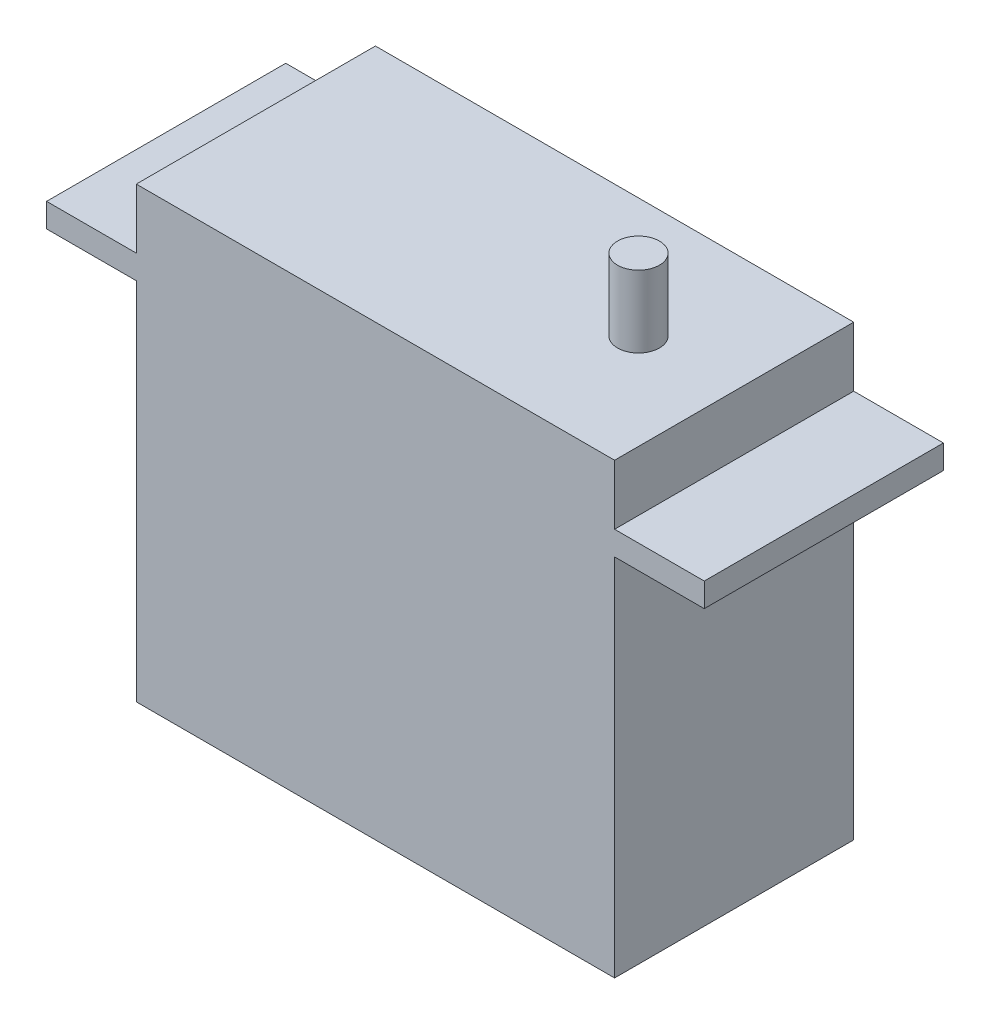
ISO-10303-21;
HEADER;
FILE_DESCRIPTION(('STEP AP214'),'2;1');
FILE_NAME('part.step','',(''),(''),'','','');
FILE_SCHEMA(('AUTOMOTIVE_DESIGN { 1 0 10303 214 1 1 1 1 }'));
ENDSEC;
DATA;
#1=APPLICATION_CONTEXT('core data for automotive mechanical design processes');
#2=APPLICATION_PROTOCOL_DEFINITION('international standard','automotive_design',2000,#1);
#3=PRODUCT_CONTEXT('',#1,'mechanical');
#4=PRODUCT('Part','Part','',(#3));
#5=PRODUCT_RELATED_PRODUCT_CATEGORY('part','',(#4));
#6=PRODUCT_DEFINITION_FORMATION('','',#4);
#7=PRODUCT_DEFINITION_CONTEXT('part definition',#1,'design');
#8=PRODUCT_DEFINITION('design','',#6,#7);
#9=PRODUCT_DEFINITION_SHAPE('','',#8);
#10=(LENGTH_UNIT() NAMED_UNIT(*) SI_UNIT(.MILLI.,.METRE.));
#11=(NAMED_UNIT(*) PLANE_ANGLE_UNIT() SI_UNIT($,.RADIAN.));
#12=(NAMED_UNIT(*) SI_UNIT($,.STERADIAN.) SOLID_ANGLE_UNIT());
#13=UNCERTAINTY_MEASURE_WITH_UNIT(LENGTH_MEASURE(1.E-05),#10,'distance_accuracy_value','');
#14=(GEOMETRIC_REPRESENTATION_CONTEXT(3) GLOBAL_UNCERTAINTY_ASSIGNED_CONTEXT((#13)) GLOBAL_UNIT_ASSIGNED_CONTEXT((#10,
#11,#12)) REPRESENTATION_CONTEXT('',''));
#15=CARTESIAN_POINT('',(0.,0.,0.));
#16=DIRECTION('',(0.,0.,1.));
#17=DIRECTION('',(1.,0.,0.));
#18=AXIS2_PLACEMENT_3D('',#15,#16,#17);
#19=CARTESIAN_POINT('',(0.,37.5,0.));
#20=DIRECTION('',(1.,0.,0.));
#21=DIRECTION('',(0.,0.,-1.));
#22=AXIS2_PLACEMENT_3D('',#19,#20,#21);
#23=PLANE('',#22);
#24=DIRECTION('',(0.,0.,-1.));
#25=VECTOR('',#24,1.);
#26=CARTESIAN_POINT('',(0.,32.5,0.));
#27=LINE('',#26,#25);
#28=CARTESIAN_POINT('',(0.,32.5,20.));
#29=VERTEX_POINT('',#28);
#30=CARTESIAN_POINT('',(0.,32.5,0.));
#31=VERTEX_POINT('',#30);
#32=EDGE_CURVE('E141',#29,#31,#27,.T.);
#33=ORIENTED_EDGE('',*,*,#32,.F.);
#34=DIRECTION('',(0.,-1.,0.));
#35=VECTOR('',#34,1.);
#36=CARTESIAN_POINT('',(0.,37.5,20.));
#37=LINE('',#36,#35);
#38=CARTESIAN_POINT('',(0.,37.5,20.));
#39=VERTEX_POINT('',#38);
#40=EDGE_CURVE('E11',#39,#29,#37,.T.);
#41=ORIENTED_EDGE('',*,*,#40,.F.);
#42=DIRECTION('',(0.,0.,1.));
#43=VECTOR('',#42,1.);
#44=CARTESIAN_POINT('',(0.,37.5,0.));
#45=LINE('',#44,#43);
#46=CARTESIAN_POINT('',(0.,37.5,0.));
#47=VERTEX_POINT('',#46);
#48=EDGE_CURVE('E179',#47,#39,#45,.T.);
#49=ORIENTED_EDGE('',*,*,#48,.F.);
#50=DIRECTION('',(0.,-1.,0.));
#51=VECTOR('',#50,1.);
#52=CARTESIAN_POINT('',(0.,37.5,0.));
#53=LINE('',#52,#51);
#54=EDGE_CURVE('E55',#47,#31,#53,.T.);
#55=ORIENTED_EDGE('',*,*,#54,.T.);
#56=EDGE_LOOP('',(#33,#41,#49,#55));
#57=FACE_BOUND('',#56,.T.);
#58=ADVANCED_FACE('F33',(#57),#23,.F.);
#59=DIRECTION('',(0.,0.,1.));
#60=VECTOR('',#59,1.);
#61=CARTESIAN_POINT('',(0.,30.5,0.));
#62=LINE('',#61,#60);
#63=CARTESIAN_POINT('',(0.,30.5,0.));
#64=VERTEX_POINT('',#63);
#65=CARTESIAN_POINT('',(0.,30.5,20.));
#66=VERTEX_POINT('',#65);
#67=EDGE_CURVE('E47',#64,#66,#62,.T.);
#68=ORIENTED_EDGE('',*,*,#67,.F.);
#69=CARTESIAN_POINT('',(0.,0.,0.));
#70=VERTEX_POINT('',#69);
#71=EDGE_CURVE('E145',#64,#70,#53,.T.);
#72=ORIENTED_EDGE('',*,*,#71,.T.);
#73=DIRECTION('',(0.,0.,1.));
#74=VECTOR('',#73,1.);
#75=CARTESIAN_POINT('',(0.,0.,0.));
#76=LINE('',#75,#74);
#77=CARTESIAN_POINT('',(0.,0.,20.));
#78=VERTEX_POINT('',#77);
#79=EDGE_CURVE('E178',#70,#78,#76,.T.);
#80=ORIENTED_EDGE('',*,*,#79,.T.);
#81=EDGE_CURVE('E40',#66,#78,#37,.T.);
#82=ORIENTED_EDGE('',*,*,#81,.F.);
#83=EDGE_LOOP('',(#68,#72,#80,#82));
#84=FACE_BOUND('',#83,.T.);
#85=ADVANCED_FACE('F275',(#84),#23,.F.);
#86=CARTESIAN_POINT('',(40.,37.5,0.));
#87=DIRECTION('',(-1.,0.,0.));
#88=DIRECTION('',(0.,0.,1.));
#89=AXIS2_PLACEMENT_3D('',#86,#87,#88);
#90=PLANE('',#89);
#91=DIRECTION('',(0.,0.,1.));
#92=VECTOR('',#91,1.);
#93=CARTESIAN_POINT('',(40.,32.5,20.));
#94=LINE('',#93,#92);
#95=CARTESIAN_POINT('',(40.,32.5,0.));
#96=VERTEX_POINT('',#95);
#97=CARTESIAN_POINT('',(40.,32.5,20.));
#98=VERTEX_POINT('',#97);
#99=EDGE_CURVE('E149',#96,#98,#94,.T.);
#100=ORIENTED_EDGE('',*,*,#99,.F.);
#101=DIRECTION('',(0.,-1.,0.));
#102=VECTOR('',#101,1.);
#103=CARTESIAN_POINT('',(40.,37.5,0.));
#104=LINE('',#103,#102);
#105=CARTESIAN_POINT('',(40.,37.5,0.));
#106=VERTEX_POINT('',#105);
#107=EDGE_CURVE('E200',#106,#96,#104,.T.);
#108=ORIENTED_EDGE('',*,*,#107,.F.);
#109=DIRECTION('',(0.,0.,-1.));
#110=VECTOR('',#109,1.);
#111=CARTESIAN_POINT('',(40.,37.5,0.));
#112=LINE('',#111,#110);
#113=CARTESIAN_POINT('',(40.,37.5,20.));
#114=VERTEX_POINT('',#113);
#115=EDGE_CURVE('E185',#114,#106,#112,.T.);
#116=ORIENTED_EDGE('',*,*,#115,.F.);
#117=DIRECTION('',(0.,-1.,0.));
#118=VECTOR('',#117,1.);
#119=CARTESIAN_POINT('',(40.,37.5,20.));
#120=LINE('',#119,#118);
#121=EDGE_CURVE('E203',#114,#98,#120,.T.);
#122=ORIENTED_EDGE('',*,*,#121,.T.);
#123=EDGE_LOOP('',(#100,#108,#116,#122));
#124=FACE_BOUND('',#123,.T.);
#125=ADVANCED_FACE('F232',(#124),#90,.F.);
#126=DIRECTION('',(0.,0.,-1.));
#127=VECTOR('',#126,1.);
#128=CARTESIAN_POINT('',(40.,30.5,20.));
#129=LINE('',#128,#127);
#130=CARTESIAN_POINT('',(40.,30.5,20.));
#131=VERTEX_POINT('',#130);
#132=CARTESIAN_POINT('',(40.,30.5,0.));
#133=VERTEX_POINT('',#132);
#134=EDGE_CURVE('E146',#131,#133,#129,.T.);
#135=ORIENTED_EDGE('',*,*,#134,.F.);
#136=CARTESIAN_POINT('',(40.,0.,20.));
#137=VERTEX_POINT('',#136);
#138=EDGE_CURVE('E202',#131,#137,#120,.T.);
#139=ORIENTED_EDGE('',*,*,#138,.T.);
#140=DIRECTION('',(0.,0.,-1.));
#141=VECTOR('',#140,1.);
#142=CARTESIAN_POINT('',(40.,0.,0.));
#143=LINE('',#142,#141);
#144=CARTESIAN_POINT('',(40.,0.,0.));
#145=VERTEX_POINT('',#144);
#146=EDGE_CURVE('E194',#137,#145,#143,.T.);
#147=ORIENTED_EDGE('',*,*,#146,.T.);
#148=EDGE_CURVE('E199',#133,#145,#104,.T.);
#149=ORIENTED_EDGE('',*,*,#148,.F.);
#150=EDGE_LOOP('',(#135,#139,#147,#149));
#151=FACE_BOUND('',#150,.T.);
#152=ADVANCED_FACE('F209',(#151),#90,.F.);
#153=CARTESIAN_POINT('',(0.,37.5,20.));
#154=DIRECTION('',(0.,0.,-1.));
#155=DIRECTION('',(-1.,0.,0.));
#156=AXIS2_PLACEMENT_3D('',#153,#154,#155);
#157=PLANE('',#156);
#158=DIRECTION('',(1.,0.,0.));
#159=VECTOR('',#158,1.);
#160=CARTESIAN_POINT('',(0.,0.,20.));
#161=LINE('',#160,#159);
#162=EDGE_CURVE('E191',#78,#137,#161,.T.);
#163=ORIENTED_EDGE('',*,*,#162,.T.);
#164=ORIENTED_EDGE('',*,*,#138,.F.);
#165=DIRECTION('',(-1.,0.,0.));
#166=VECTOR('',#165,1.);
#167=CARTESIAN_POINT('',(47.5,30.5,20.));
#168=LINE('',#167,#166);
#169=CARTESIAN_POINT('',(47.5,30.5,20.));
#170=VERTEX_POINT('',#169);
#171=EDGE_CURVE('E175',#170,#131,#168,.T.);
#172=ORIENTED_EDGE('',*,*,#171,.F.);
#173=DIRECTION('',(0.,-1.,0.));
#174=VECTOR('',#173,1.);
#175=CARTESIAN_POINT('',(47.5,32.5,20.));
#176=LINE('',#175,#174);
#177=CARTESIAN_POINT('',(47.5,32.5,20.));
#178=VERTEX_POINT('',#177);
#179=EDGE_CURVE('E155',#178,#170,#176,.T.);
#180=ORIENTED_EDGE('',*,*,#179,.F.);
#181=DIRECTION('',(-1.,0.,0.));
#182=VECTOR('',#181,1.);
#183=CARTESIAN_POINT('',(47.5,32.5,20.));
#184=LINE('',#183,#182);
#185=EDGE_CURVE('E163',#178,#98,#184,.T.);
#186=ORIENTED_EDGE('',*,*,#185,.T.);
#187=ORIENTED_EDGE('',*,*,#121,.F.);
#188=DIRECTION('',(1.,0.,0.));
#189=VECTOR('',#188,1.);
#190=CARTESIAN_POINT('',(0.,37.5,20.));
#191=LINE('',#190,#189);
#192=EDGE_CURVE('E182',#39,#114,#191,.T.);
#193=ORIENTED_EDGE('',*,*,#192,.F.);
#194=ORIENTED_EDGE('',*,*,#40,.T.);
#195=DIRECTION('',(1.,0.,0.));
#196=VECTOR('',#195,1.);
#197=CARTESIAN_POINT('',(-7.49999999999999,32.5,20.));
#198=LINE('',#197,#196);
#199=CARTESIAN_POINT('',(-7.49999999999999,32.5,20.));
#200=VERTEX_POINT('',#199);
#201=EDGE_CURVE('E151',#200,#29,#198,.T.);
#202=ORIENTED_EDGE('',*,*,#201,.F.);
#203=DIRECTION('',(0.,1.,0.));
#204=VECTOR('',#203,1.);
#205=CARTESIAN_POINT('',(-7.49999999999999,32.5,20.));
#206=LINE('',#205,#204);
#207=CARTESIAN_POINT('',(-7.49999999999999,30.5,20.));
#208=VERTEX_POINT('',#207);
#209=EDGE_CURVE('E131',#208,#200,#206,.T.);
#210=ORIENTED_EDGE('',*,*,#209,.F.);
#211=DIRECTION('',(1.,0.,0.));
#212=VECTOR('',#211,1.);
#213=CARTESIAN_POINT('',(-7.49999999999999,30.5,20.));
#214=LINE('',#213,#212);
#215=EDGE_CURVE('E128',#208,#66,#214,.T.);
#216=ORIENTED_EDGE('',*,*,#215,.T.);
#217=ORIENTED_EDGE('',*,*,#81,.T.);
#218=EDGE_LOOP('',(#163,#164,#172,#180,#186,#187,#193,#194,#202,#210,#216,#217));
#219=FACE_BOUND('',#218,.T.);
#220=ADVANCED_FACE('F215',(#219),#157,.F.);
#221=CARTESIAN_POINT('',(0.,37.5,0.));
#222=DIRECTION('',(0.,0.,1.));
#223=DIRECTION('',(1.,0.,0.));
#224=AXIS2_PLACEMENT_3D('',#221,#222,#223);
#225=PLANE('',#224);
#226=DIRECTION('',(-1.,0.,0.));
#227=VECTOR('',#226,1.);
#228=CARTESIAN_POINT('',(0.,0.,0.));
#229=LINE('',#228,#227);
#230=EDGE_CURVE('E183',#145,#70,#229,.T.);
#231=ORIENTED_EDGE('',*,*,#230,.T.);
#232=ORIENTED_EDGE('',*,*,#71,.F.);
#233=DIRECTION('',(1.,0.,0.));
#234=VECTOR('',#233,1.);
#235=CARTESIAN_POINT('',(-7.5,30.5,0.));
#236=LINE('',#235,#234);
#237=CARTESIAN_POINT('',(-7.5,30.5,0.));
#238=VERTEX_POINT('',#237);
#239=EDGE_CURVE('E126',#238,#64,#236,.T.);
#240=ORIENTED_EDGE('',*,*,#239,.F.);
#241=DIRECTION('',(0.,-1.,0.));
#242=VECTOR('',#241,1.);
#243=CARTESIAN_POINT('',(-7.5,32.5,0.));
#244=LINE('',#243,#242);
#245=CARTESIAN_POINT('',(-7.5,32.5,0.));
#246=VERTEX_POINT('',#245);
#247=EDGE_CURVE('E132',#246,#238,#244,.T.);
#248=ORIENTED_EDGE('',*,*,#247,.F.);
#249=DIRECTION('',(1.,0.,0.));
#250=VECTOR('',#249,1.);
#251=CARTESIAN_POINT('',(-7.5,32.5,0.));
#252=LINE('',#251,#250);
#253=EDGE_CURVE('E241',#246,#31,#252,.T.);
#254=ORIENTED_EDGE('',*,*,#253,.T.);
#255=ORIENTED_EDGE('',*,*,#54,.F.);
#256=DIRECTION('',(-1.,0.,0.));
#257=VECTOR('',#256,1.);
#258=CARTESIAN_POINT('',(0.,37.5,0.));
#259=LINE('',#258,#257);
#260=EDGE_CURVE('E187',#106,#47,#259,.T.);
#261=ORIENTED_EDGE('',*,*,#260,.F.);
#262=ORIENTED_EDGE('',*,*,#107,.T.);
#263=DIRECTION('',(-1.,0.,0.));
#264=VECTOR('',#263,1.);
#265=CARTESIAN_POINT('',(47.5,32.5,0.));
#266=LINE('',#265,#264);
#267=CARTESIAN_POINT('',(47.5,32.5,0.));
#268=VERTEX_POINT('',#267);
#269=EDGE_CURVE('E169',#268,#96,#266,.T.);
#270=ORIENTED_EDGE('',*,*,#269,.F.);
#271=DIRECTION('',(0.,1.,0.));
#272=VECTOR('',#271,1.);
#273=CARTESIAN_POINT('',(47.5,32.5,0.));
#274=LINE('',#273,#272);
#275=CARTESIAN_POINT('',(47.5,30.5,0.));
#276=VERTEX_POINT('',#275);
#277=EDGE_CURVE('E160',#276,#268,#274,.T.);
#278=ORIENTED_EDGE('',*,*,#277,.F.);
#279=DIRECTION('',(-1.,0.,0.));
#280=VECTOR('',#279,1.);
#281=CARTESIAN_POINT('',(47.5,30.5,0.));
#282=LINE('',#281,#280);
#283=EDGE_CURVE('E172',#276,#133,#282,.T.);
#284=ORIENTED_EDGE('',*,*,#283,.T.);
#285=ORIENTED_EDGE('',*,*,#148,.T.);
#286=EDGE_LOOP('',(#231,#232,#240,#248,#254,#255,#261,#262,#270,#278,#284,#285));
#287=FACE_BOUND('',#286,.T.);
#288=ADVANCED_FACE('F144',(#287),#225,.F.);
#289=CARTESIAN_POINT('',(0.,37.5,0.));
#290=DIRECTION('',(0.,1.,0.));
#291=DIRECTION('',(0.,0.,1.));
#292=AXIS2_PLACEMENT_3D('',#289,#290,#291);
#293=PLANE('',#292);
#294=CARTESIAN_POINT('',(32.,37.5,10.));
#295=DIRECTION('',(0.,1.,0.));
#296=DIRECTION('',(0.,0.,1.));
#297=AXIS2_PLACEMENT_3D('',#294,#295,#296);
#298=CIRCLE('',#297,1.75);
#299=CARTESIAN_POINT('',(32.,37.5,11.75));
#300=VERTEX_POINT('',#299);
#301=EDGE_CURVE('E249',#300,#300,#298,.T.);
#302=ORIENTED_EDGE('',*,*,#301,.F.);
#303=EDGE_LOOP('',(#302));
#304=FACE_BOUND('',#303,.T.);
#305=ORIENTED_EDGE('',*,*,#48,.T.);
#306=ORIENTED_EDGE('',*,*,#192,.T.);
#307=ORIENTED_EDGE('',*,*,#115,.T.);
#308=ORIENTED_EDGE('',*,*,#260,.T.);
#309=EDGE_LOOP('',(#305,#306,#307,#308));
#310=FACE_BOUND('',#309,.T.);
#311=ADVANCED_FACE('F235',(#304,#310),#293,.T.);
#312=CARTESIAN_POINT('',(0.,0.,0.));
#313=DIRECTION('',(0.,1.,0.));
#314=DIRECTION('',(0.,0.,1.));
#315=AXIS2_PLACEMENT_3D('',#312,#313,#314);
#316=PLANE('',#315);
#317=ORIENTED_EDGE('',*,*,#79,.F.);
#318=ORIENTED_EDGE('',*,*,#230,.F.);
#319=ORIENTED_EDGE('',*,*,#146,.F.);
#320=ORIENTED_EDGE('',*,*,#162,.F.);
#321=EDGE_LOOP('',(#317,#318,#319,#320));
#322=FACE_BOUND('',#321,.T.);
#323=ADVANCED_FACE('F218',(#322),#316,.F.);
#324=CARTESIAN_POINT('',(47.5,30.5,20.));
#325=DIRECTION('',(0.,1.,0.));
#326=DIRECTION('',(0.,0.,1.));
#327=AXIS2_PLACEMENT_3D('',#324,#325,#326);
#328=PLANE('',#327);
#329=ORIENTED_EDGE('',*,*,#134,.T.);
#330=ORIENTED_EDGE('',*,*,#283,.F.);
#331=DIRECTION('',(0.,0.,-1.));
#332=VECTOR('',#331,1.);
#333=CARTESIAN_POINT('',(47.5,30.5,20.));
#334=LINE('',#333,#332);
#335=EDGE_CURVE('E158',#170,#276,#334,.T.);
#336=ORIENTED_EDGE('',*,*,#335,.F.);
#337=ORIENTED_EDGE('',*,*,#171,.T.);
#338=EDGE_LOOP('',(#329,#330,#336,#337));
#339=FACE_BOUND('',#338,.T.);
#340=ADVANCED_FACE('F222',(#339),#328,.F.);
#341=CARTESIAN_POINT('',(47.5,32.5,20.));
#342=DIRECTION('',(0.,-1.,0.));
#343=DIRECTION('',(0.,0.,-1.));
#344=AXIS2_PLACEMENT_3D('',#341,#342,#343);
#345=PLANE('',#344);
#346=ORIENTED_EDGE('',*,*,#99,.T.);
#347=ORIENTED_EDGE('',*,*,#185,.F.);
#348=DIRECTION('',(0.,0.,1.));
#349=VECTOR('',#348,1.);
#350=CARTESIAN_POINT('',(47.5,32.5,20.));
#351=LINE('',#350,#349);
#352=EDGE_CURVE('E162',#268,#178,#351,.T.);
#353=ORIENTED_EDGE('',*,*,#352,.F.);
#354=ORIENTED_EDGE('',*,*,#269,.T.);
#355=EDGE_LOOP('',(#346,#347,#353,#354));
#356=FACE_BOUND('',#355,.T.);
#357=ADVANCED_FACE('F230',(#356),#345,.F.);
#358=CARTESIAN_POINT('',(47.5,0.,0.));
#359=DIRECTION('',(1.,0.,0.));
#360=DIRECTION('',(0.,0.,-1.));
#361=AXIS2_PLACEMENT_3D('',#358,#359,#360);
#362=PLANE('',#361);
#363=ORIENTED_EDGE('',*,*,#179,.T.);
#364=ORIENTED_EDGE('',*,*,#335,.T.);
#365=ORIENTED_EDGE('',*,*,#277,.T.);
#366=ORIENTED_EDGE('',*,*,#352,.T.);
#367=EDGE_LOOP('',(#363,#364,#365,#366));
#368=FACE_BOUND('',#367,.T.);
#369=ADVANCED_FACE('F226',(#368),#362,.T.);
#370=CARTESIAN_POINT('',(-7.5,30.5,0.));
#371=DIRECTION('',(0.,1.,0.));
#372=DIRECTION('',(0.,0.,1.));
#373=AXIS2_PLACEMENT_3D('',#370,#371,#372);
#374=PLANE('',#373);
#375=ORIENTED_EDGE('',*,*,#67,.T.);
#376=ORIENTED_EDGE('',*,*,#215,.F.);
#377=DIRECTION('',(0.,0.,1.));
#378=VECTOR('',#377,1.);
#379=CARTESIAN_POINT('',(-7.5,30.5,0.));
#380=LINE('',#379,#378);
#381=EDGE_CURVE('E122',#238,#208,#380,.T.);
#382=ORIENTED_EDGE('',*,*,#381,.F.);
#383=ORIENTED_EDGE('',*,*,#239,.T.);
#384=EDGE_LOOP('',(#375,#376,#382,#383));
#385=FACE_BOUND('',#384,.T.);
#386=ADVANCED_FACE('F124',(#385),#374,.F.);
#387=CARTESIAN_POINT('',(-7.5,32.5,0.));
#388=DIRECTION('',(0.,-1.,0.));
#389=DIRECTION('',(0.,0.,-1.));
#390=AXIS2_PLACEMENT_3D('',#387,#388,#389);
#391=PLANE('',#390);
#392=ORIENTED_EDGE('',*,*,#32,.T.);
#393=ORIENTED_EDGE('',*,*,#253,.F.);
#394=DIRECTION('',(0.,0.,-1.));
#395=VECTOR('',#394,1.);
#396=CARTESIAN_POINT('',(-7.5,32.5,0.));
#397=LINE('',#396,#395);
#398=EDGE_CURVE('E137',#200,#246,#397,.T.);
#399=ORIENTED_EDGE('',*,*,#398,.F.);
#400=ORIENTED_EDGE('',*,*,#201,.T.);
#401=EDGE_LOOP('',(#392,#393,#399,#400));
#402=FACE_BOUND('',#401,.T.);
#403=ADVANCED_FACE('F240',(#402),#391,.F.);
#404=CARTESIAN_POINT('',(-7.5,0.,0.));
#405=DIRECTION('',(-1.,0.,0.));
#406=DIRECTION('',(0.,0.,1.));
#407=AXIS2_PLACEMENT_3D('',#404,#405,#406);
#408=PLANE('',#407);
#409=ORIENTED_EDGE('',*,*,#247,.T.);
#410=ORIENTED_EDGE('',*,*,#381,.T.);
#411=ORIENTED_EDGE('',*,*,#209,.T.);
#412=ORIENTED_EDGE('',*,*,#398,.T.);
#413=EDGE_LOOP('',(#409,#410,#411,#412));
#414=FACE_BOUND('',#413,.T.);
#415=ADVANCED_FACE('F135',(#414),#408,.T.);
#416=CARTESIAN_POINT('',(32.,43.5,10.));
#417=DIRECTION('',(0.,-1.,0.));
#418=DIRECTION('',(0.,0.,-1.));
#419=AXIS2_PLACEMENT_3D('',#416,#417,#418);
#420=CYLINDRICAL_SURFACE('',#419,1.75);
#421=CARTESIAN_POINT('',(32.,43.5,10.));
#422=DIRECTION('',(0.,1.,0.));
#423=DIRECTION('',(0.,0.,1.));
#424=AXIS2_PLACEMENT_3D('',#421,#422,#423);
#425=CIRCLE('',#424,1.75);
#426=CARTESIAN_POINT('',(32.,43.5,11.75));
#427=VERTEX_POINT('',#426);
#428=EDGE_CURVE('E246',#427,#427,#425,.T.);
#429=ORIENTED_EDGE('',*,*,#428,.F.);
#430=EDGE_LOOP('',(#429));
#431=FACE_BOUND('',#430,.T.);
#432=ORIENTED_EDGE('',*,*,#301,.T.);
#433=EDGE_LOOP('',(#432));
#434=FACE_BOUND('',#433,.T.);
#435=ADVANCED_FACE('F257',(#431,#434),#420,.T.);
#436=CARTESIAN_POINT('',(32.,43.5,10.));
#437=DIRECTION('',(0.,1.,0.));
#438=DIRECTION('',(0.,0.,1.));
#439=AXIS2_PLACEMENT_3D('',#436,#437,#438);
#440=PLANE('',#439);
#441=ORIENTED_EDGE('',*,*,#428,.T.);
#442=EDGE_LOOP('',(#441));
#443=FACE_BOUND('',#442,.T.);
#444=ADVANCED_FACE('F255',(#443),#440,.T.);
#445=CLOSED_SHELL('',(#58,#85,#125,#152,#220,#288,#311,#323,#340,#357,#369,#386,#403,#415,#435,#444));
#446=MANIFOLD_SOLID_BREP('B2',#445);
#447=ADVANCED_BREP_SHAPE_REPRESENTATION('',(#18,#446),#14);
#448=SHAPE_DEFINITION_REPRESENTATION(#9,#447);
ENDSEC;
END-ISO-10303-21;
